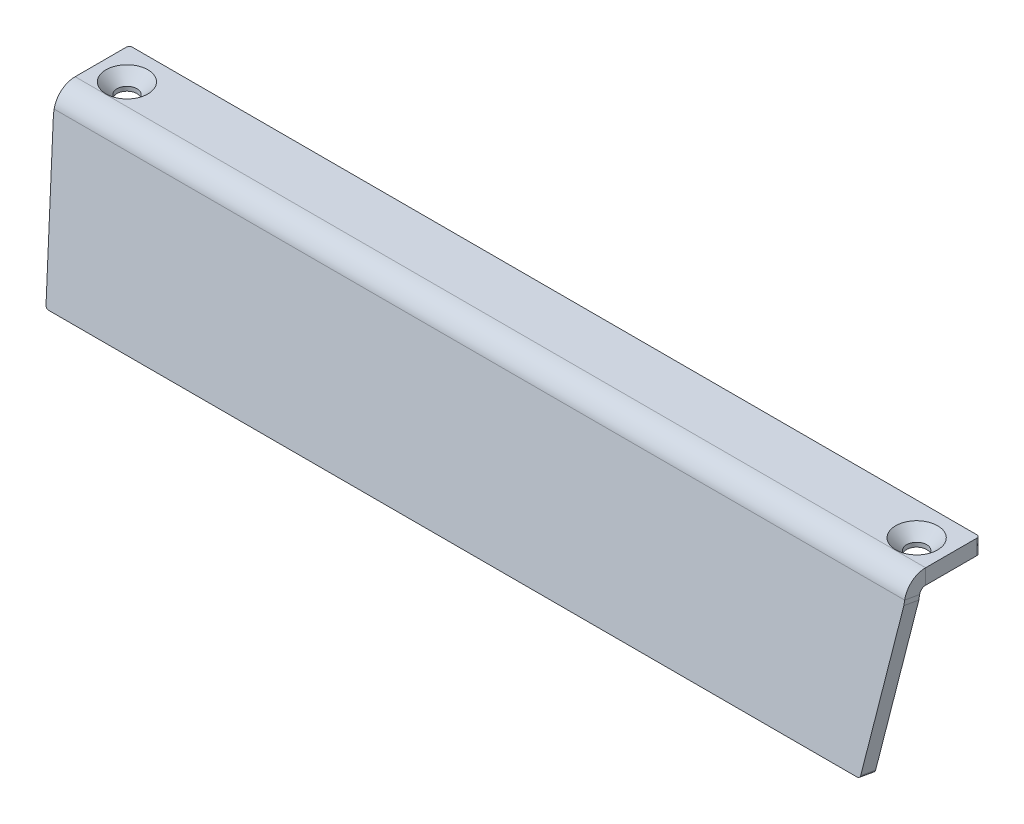
ISO-10303-21;
HEADER;
FILE_DESCRIPTION(('STEP AP214'),'2;1');
FILE_NAME('part.step','',(''),(''),'','','');
FILE_SCHEMA(('AUTOMOTIVE_DESIGN { 1 0 10303 214 1 1 1 1 }'));
ENDSEC;
DATA;
#1=APPLICATION_CONTEXT('core data for automotive mechanical design processes');
#2=APPLICATION_PROTOCOL_DEFINITION('international standard','automotive_design',2000,#1);
#3=PRODUCT_CONTEXT('',#1,'mechanical');
#4=PRODUCT('Part','Part','',(#3));
#5=PRODUCT_RELATED_PRODUCT_CATEGORY('part','',(#4));
#6=PRODUCT_DEFINITION_FORMATION('','',#4);
#7=PRODUCT_DEFINITION_CONTEXT('part definition',#1,'design');
#8=PRODUCT_DEFINITION('design','',#6,#7);
#9=PRODUCT_DEFINITION_SHAPE('','',#8);
#10=(LENGTH_UNIT() NAMED_UNIT(*) SI_UNIT(.MILLI.,.METRE.));
#11=(NAMED_UNIT(*) PLANE_ANGLE_UNIT() SI_UNIT($,.RADIAN.));
#12=(NAMED_UNIT(*) SI_UNIT($,.STERADIAN.) SOLID_ANGLE_UNIT());
#13=UNCERTAINTY_MEASURE_WITH_UNIT(LENGTH_MEASURE(1.E-05),#10,'distance_accuracy_value','');
#14=(GEOMETRIC_REPRESENTATION_CONTEXT(3) GLOBAL_UNCERTAINTY_ASSIGNED_CONTEXT((#13)) GLOBAL_UNIT_ASSIGNED_CONTEXT((#10,
#11,#12)) REPRESENTATION_CONTEXT('',''));
#15=CARTESIAN_POINT('',(0.,0.,0.));
#16=DIRECTION('',(0.,0.,1.));
#17=DIRECTION('',(1.,0.,0.));
#18=AXIS2_PLACEMENT_3D('',#15,#16,#17);
#19=CARTESIAN_POINT('',(-70.,-2.5,0.));
#20=DIRECTION('',(-1.,0.,0.));
#21=DIRECTION('',(0.,0.,1.));
#22=AXIS2_PLACEMENT_3D('',#19,#20,#21);
#23=PLANE('',#22);
#24=DIRECTION('',(0.,0.,1.));
#25=VECTOR('',#24,1.);
#26=CARTESIAN_POINT('',(-70.,0.,0.));
#27=LINE('',#26,#25);
#28=CARTESIAN_POINT('',(-70.,0.,0.5));
#29=VERTEX_POINT('',#28);
#30=CARTESIAN_POINT('',(-70.,0.,8.92000000000002));
#31=VERTEX_POINT('',#30);
#32=EDGE_CURVE('E225',#29,#31,#27,.T.);
#33=ORIENTED_EDGE('',*,*,#32,.F.);
#34=DIRECTION('',(0.,1.,0.));
#35=VECTOR('',#34,1.);
#36=CARTESIAN_POINT('',(-70.,-2.5,0.5));
#37=LINE('',#36,#35);
#38=CARTESIAN_POINT('',(-70.,-2.5,0.5));
#39=VERTEX_POINT('',#38);
#40=EDGE_CURVE('E87',#29,#39,#37,.F.);
#41=ORIENTED_EDGE('',*,*,#40,.T.);
#42=DIRECTION('',(0.,0.,1.));
#43=VECTOR('',#42,1.);
#44=CARTESIAN_POINT('',(-70.,-2.5,0.));
#45=LINE('',#44,#43);
#46=CARTESIAN_POINT('',(-70.,-2.50000000000001,8.92));
#47=VERTEX_POINT('',#46);
#48=EDGE_CURVE('E230',#39,#47,#45,.T.);
#49=ORIENTED_EDGE('',*,*,#48,.T.);
#50=DIRECTION('',(0.,1.,0.));
#51=VECTOR('',#50,1.);
#52=CARTESIAN_POINT('',(-70.,-2.5,8.92));
#53=LINE('',#52,#51);
#54=EDGE_CURVE('E240',#47,#31,#53,.T.);
#55=ORIENTED_EDGE('',*,*,#54,.T.);
#56=EDGE_LOOP('',(#33,#41,#49,#55));
#57=FACE_BOUND('',#56,.T.);
#58=ADVANCED_FACE('F64',(#57),#23,.T.);
#59=CARTESIAN_POINT('',(-70.,-2.5,0.));
#60=DIRECTION('',(0.,0.,-1.));
#61=DIRECTION('',(-1.,0.,0.));
#62=AXIS2_PLACEMENT_3D('',#59,#60,#61);
#63=PLANE('',#62);
#64=DIRECTION('',(-1.,0.,0.));
#65=VECTOR('',#64,1.);
#66=CARTESIAN_POINT('',(-70.,-2.5,0.));
#67=LINE('',#66,#65);
#68=CARTESIAN_POINT('',(69.5,-2.5,0.));
#69=VERTEX_POINT('',#68);
#70=CARTESIAN_POINT('',(-69.5,-2.5,0.));
#71=VERTEX_POINT('',#70);
#72=EDGE_CURVE('E237',#69,#71,#67,.T.);
#73=ORIENTED_EDGE('',*,*,#72,.T.);
#74=DIRECTION('',(0.,1.,0.));
#75=VECTOR('',#74,1.);
#76=CARTESIAN_POINT('',(-69.5,-2.5,0.));
#77=LINE('',#76,#75);
#78=CARTESIAN_POINT('',(-69.5,0.,0.));
#79=VERTEX_POINT('',#78);
#80=EDGE_CURVE('E285',#71,#79,#77,.T.);
#81=ORIENTED_EDGE('',*,*,#80,.T.);
#82=DIRECTION('',(-1.,0.,0.));
#83=VECTOR('',#82,1.);
#84=CARTESIAN_POINT('',(-70.,0.,0.));
#85=LINE('',#84,#83);
#86=CARTESIAN_POINT('',(69.5,0.,0.));
#87=VERTEX_POINT('',#86);
#88=EDGE_CURVE('E233',#87,#79,#85,.T.);
#89=ORIENTED_EDGE('',*,*,#88,.F.);
#90=DIRECTION('',(0.,1.,0.));
#91=VECTOR('',#90,1.);
#92=CARTESIAN_POINT('',(69.5,-2.5,0.));
#93=LINE('',#92,#91);
#94=EDGE_CURVE('E283',#87,#69,#93,.F.);
#95=ORIENTED_EDGE('',*,*,#94,.T.);
#96=EDGE_LOOP('',(#73,#81,#89,#95));
#97=FACE_BOUND('',#96,.T.);
#98=ADVANCED_FACE('F299',(#97),#63,.T.);
#99=CARTESIAN_POINT('',(70.,-2.5,0.));
#100=DIRECTION('',(1.,0.,0.));
#101=DIRECTION('',(0.,0.,-1.));
#102=AXIS2_PLACEMENT_3D('',#99,#100,#101);
#103=PLANE('',#102);
#104=DIRECTION('',(0.,0.,-1.));
#105=VECTOR('',#104,1.);
#106=CARTESIAN_POINT('',(70.,-2.5,0.));
#107=LINE('',#106,#105);
#108=CARTESIAN_POINT('',(70.,-2.50000000000001,8.92));
#109=VERTEX_POINT('',#108);
#110=CARTESIAN_POINT('',(70.,-2.5,0.499999999999983));
#111=VERTEX_POINT('',#110);
#112=EDGE_CURVE('E235',#109,#111,#107,.T.);
#113=ORIENTED_EDGE('',*,*,#112,.T.);
#114=DIRECTION('',(0.,1.,0.));
#115=VECTOR('',#114,1.);
#116=CARTESIAN_POINT('',(70.,-2.5,0.499999999999983));
#117=LINE('',#116,#115);
#118=CARTESIAN_POINT('',(70.,0.,0.499999999999983));
#119=VERTEX_POINT('',#118);
#120=EDGE_CURVE('E13',#111,#119,#117,.T.);
#121=ORIENTED_EDGE('',*,*,#120,.T.);
#122=DIRECTION('',(0.,0.,-1.));
#123=VECTOR('',#122,1.);
#124=CARTESIAN_POINT('',(70.,0.,0.));
#125=LINE('',#124,#123);
#126=CARTESIAN_POINT('',(70.,0.,8.91999999999998));
#127=VERTEX_POINT('',#126);
#128=EDGE_CURVE('E243',#127,#119,#125,.T.);
#129=ORIENTED_EDGE('',*,*,#128,.F.);
#130=DIRECTION('',(0.,1.,0.));
#131=VECTOR('',#130,1.);
#132=CARTESIAN_POINT('',(70.,-2.5,8.91999999999998));
#133=LINE('',#132,#131);
#134=EDGE_CURVE('E248',#109,#127,#133,.T.);
#135=ORIENTED_EDGE('',*,*,#134,.F.);
#136=EDGE_LOOP('',(#113,#121,#129,#135));
#137=FACE_BOUND('',#136,.T.);
#138=ADVANCED_FACE('F312',(#137),#103,.T.);
#139=CARTESIAN_POINT('',(0.,-2.5,0.));
#140=DIRECTION('',(0.,1.,0.));
#141=DIRECTION('',(0.,0.,1.));
#142=AXIS2_PLACEMENT_3D('',#139,#140,#141);
#143=PLANE('',#142);
#144=CARTESIAN_POINT('',(65.,-2.5,5.38999999999998));
#145=DIRECTION('',(0.,1.,0.));
#146=DIRECTION('',(0.,0.,1.));
#147=AXIS2_PLACEMENT_3D('',#144,#145,#146);
#148=CIRCLE('',#147,1.65);
#149=CARTESIAN_POINT('',(65.,-2.5,7.03999999999999));
#150=VERTEX_POINT('',#149);
#151=EDGE_CURVE('E367',#150,#150,#148,.T.);
#152=ORIENTED_EDGE('',*,*,#151,.T.);
#153=EDGE_LOOP('',(#152));
#154=FACE_BOUND('',#153,.T.);
#155=CARTESIAN_POINT('',(-65.,-2.5,5.39));
#156=DIRECTION('',(0.,1.,0.));
#157=DIRECTION('',(0.,0.,1.));
#158=AXIS2_PLACEMENT_3D('',#155,#156,#157);
#159=CIRCLE('',#158,1.65);
#160=CARTESIAN_POINT('',(-65.,-2.5,7.04));
#161=VERTEX_POINT('',#160);
#162=EDGE_CURVE('E224',#161,#161,#159,.T.);
#163=ORIENTED_EDGE('',*,*,#162,.T.);
#164=EDGE_LOOP('',(#163));
#165=FACE_BOUND('',#164,.T.);
#166=ORIENTED_EDGE('',*,*,#48,.F.);
#167=CARTESIAN_POINT('',(-69.5,-2.5,0.5));
#168=DIRECTION('',(0.,1.,0.));
#169=DIRECTION('',(0.,0.,1.));
#170=AXIS2_PLACEMENT_3D('',#167,#168,#169);
#171=CIRCLE('',#170,0.5);
#172=EDGE_CURVE('E72',#39,#71,#171,.F.);
#173=ORIENTED_EDGE('',*,*,#172,.T.);
#174=ORIENTED_EDGE('',*,*,#72,.F.);
#175=CARTESIAN_POINT('',(69.5,-2.5,0.499999999999983));
#176=DIRECTION('',(0.,1.,0.));
#177=DIRECTION('',(0.,0.,1.));
#178=AXIS2_PLACEMENT_3D('',#175,#176,#177);
#179=CIRCLE('',#178,0.5);
#180=EDGE_CURVE('E79',#69,#111,#179,.F.);
#181=ORIENTED_EDGE('',*,*,#180,.T.);
#182=ORIENTED_EDGE('',*,*,#112,.F.);
#183=DIRECTION('',(1.,0.,0.));
#184=VECTOR('',#183,1.);
#185=CARTESIAN_POINT('',(-70.,-2.5,8.92));
#186=LINE('',#185,#184);
#187=EDGE_CURVE('E232',#47,#109,#186,.T.);
#188=ORIENTED_EDGE('',*,*,#187,.F.);
#189=EDGE_LOOP('',(#166,#173,#174,#181,#182,#188));
#190=FACE_BOUND('',#189,.T.);
#191=ADVANCED_FACE('F294',(#154,#165,#190),#143,.F.);
#192=CARTESIAN_POINT('',(0.,0.,0.));
#193=DIRECTION('',(0.,1.,0.));
#194=DIRECTION('',(0.,0.,1.));
#195=AXIS2_PLACEMENT_3D('',#192,#193,#194);
#196=PLANE('',#195);
#197=CARTESIAN_POINT('',(-65.,0.,5.38999999999998));
#198=DIRECTION('',(0.,1.,0.));
#199=DIRECTION('',(0.,0.,-1.));
#200=AXIS2_PLACEMENT_3D('',#197,#198,#199);
#201=CIRCLE('',#200,3.45000000000001);
#202=CARTESIAN_POINT('',(-65.,0.,1.93999999999998));
#203=VERTEX_POINT('',#202);
#204=EDGE_CURVE('E379',#203,#203,#201,.T.);
#205=ORIENTED_EDGE('',*,*,#204,.F.);
#206=EDGE_LOOP('',(#205));
#207=FACE_BOUND('',#206,.T.);
#208=CARTESIAN_POINT('',(65.,0.,5.38999999999998));
#209=DIRECTION('',(0.,-1.,0.));
#210=DIRECTION('',(0.,0.,-1.));
#211=AXIS2_PLACEMENT_3D('',#208,#209,#210);
#212=CIRCLE('',#211,3.45000000000001);
#213=CARTESIAN_POINT('',(65.,0.,1.93999999999998));
#214=VERTEX_POINT('',#213);
#215=EDGE_CURVE('E373',#214,#214,#212,.T.);
#216=ORIENTED_EDGE('',*,*,#215,.T.);
#217=EDGE_LOOP('',(#216));
#218=FACE_BOUND('',#217,.T.);
#219=ORIENTED_EDGE('',*,*,#88,.T.);
#220=CARTESIAN_POINT('',(-69.5,0.,0.5));
#221=DIRECTION('',(0.,1.,0.));
#222=DIRECTION('',(0.,0.,1.));
#223=AXIS2_PLACEMENT_3D('',#220,#221,#222);
#224=CIRCLE('',#223,0.5);
#225=EDGE_CURVE('E290',#79,#29,#224,.T.);
#226=ORIENTED_EDGE('',*,*,#225,.T.);
#227=ORIENTED_EDGE('',*,*,#32,.T.);
#228=DIRECTION('',(1.,0.,0.));
#229=VECTOR('',#228,1.);
#230=CARTESIAN_POINT('',(-70.,0.,8.92));
#231=LINE('',#230,#229);
#232=EDGE_CURVE('E176',#31,#127,#231,.T.);
#233=ORIENTED_EDGE('',*,*,#232,.T.);
#234=ORIENTED_EDGE('',*,*,#128,.T.);
#235=CARTESIAN_POINT('',(69.5,0.,0.499999999999983));
#236=DIRECTION('',(0.,1.,0.));
#237=DIRECTION('',(0.,0.,1.));
#238=AXIS2_PLACEMENT_3D('',#235,#236,#237);
#239=CIRCLE('',#238,0.5);
#240=EDGE_CURVE('E288',#119,#87,#239,.T.);
#241=ORIENTED_EDGE('',*,*,#240,.T.);
#242=EDGE_LOOP('',(#219,#226,#227,#233,#234,#241));
#243=FACE_BOUND('',#242,.T.);
#244=ADVANCED_FACE('F304',(#207,#218,#243),#196,.T.);
#245=CARTESIAN_POINT('',(70.,-3.5,8.91999999999999));
#246=DIRECTION('',(1.,0.,0.));
#247=DIRECTION('',(0.,0.,-1.));
#248=AXIS2_PLACEMENT_3D('',#245,#246,#247);
#249=PLANE('',#248);
#250=DIRECTION('',(0.,-0.173648177666934,-0.984807753012207));
#251=VECTOR('',#250,1.);
#252=CARTESIAN_POINT('',(70.,-2.89223137816573,12.3668271355427));
#253=LINE('',#252,#251);
#254=CARTESIAN_POINT('',(70.,-3.32635182233307,9.90480775301219));
#255=VERTEX_POINT('',#254);
#256=CARTESIAN_POINT('',(70.,-2.89223137816573,12.3668271355427));
#257=VERTEX_POINT('',#256);
#258=EDGE_CURVE('E221',#255,#257,#253,.F.);
#259=ORIENTED_EDGE('',*,*,#258,.F.);
#260=CARTESIAN_POINT('',(70.,-3.5,8.91999999999999));
#261=DIRECTION('',(-1.,0.,0.));
#262=DIRECTION('',(0.,0.,1.));
#263=AXIS2_PLACEMENT_3D('',#260,#261,#262);
#264=CIRCLE('',#263,0.999999999999993);
#265=EDGE_CURVE('E181',#109,#255,#264,.F.);
#266=ORIENTED_EDGE('',*,*,#265,.F.);
#267=ORIENTED_EDGE('',*,*,#134,.T.);
#268=CARTESIAN_POINT('',(70.,-3.5,8.91999999999999));
#269=DIRECTION('',(-1.,0.,0.));
#270=DIRECTION('',(0.,0.,1.));
#271=AXIS2_PLACEMENT_3D('',#268,#269,#270);
#272=CIRCLE('',#271,3.49999999999999);
#273=EDGE_CURVE('E180',#127,#257,#272,.F.);
#274=ORIENTED_EDGE('',*,*,#273,.T.);
#275=EDGE_LOOP('',(#259,#266,#267,#274));
#276=FACE_BOUND('',#275,.T.);
#277=ADVANCED_FACE('F387',(#276),#249,.T.);
#278=CARTESIAN_POINT('',(-70.,-3.5,8.91999999999999));
#279=DIRECTION('',(1.,0.,0.));
#280=DIRECTION('',(0.,0.,-1.));
#281=AXIS2_PLACEMENT_3D('',#278,#279,#280);
#282=PLANE('',#281);
#283=CARTESIAN_POINT('',(-70.,-3.5,8.91999999999999));
#284=DIRECTION('',(-1.,0.,0.));
#285=DIRECTION('',(0.,0.,1.));
#286=AXIS2_PLACEMENT_3D('',#283,#284,#285);
#287=CIRCLE('',#286,0.999999999999993);
#288=CARTESIAN_POINT('',(-70.,-3.32635182233307,9.90480775301219));
#289=VERTEX_POINT('',#288);
#290=EDGE_CURVE('E188',#289,#47,#287,.T.);
#291=ORIENTED_EDGE('',*,*,#290,.F.);
#292=DIRECTION('',(0.,-0.173648177666934,-0.984807753012207));
#293=VECTOR('',#292,1.);
#294=CARTESIAN_POINT('',(-70.,-3.32635182233307,9.90480775301221));
#295=LINE('',#294,#293);
#296=CARTESIAN_POINT('',(-70.,-2.89223137816573,12.3668271355427));
#297=VERTEX_POINT('',#296);
#298=EDGE_CURVE('E185',#289,#297,#295,.F.);
#299=ORIENTED_EDGE('',*,*,#298,.T.);
#300=CARTESIAN_POINT('',(-70.,-3.5,8.91999999999999));
#301=DIRECTION('',(-1.,0.,0.));
#302=DIRECTION('',(0.,0.,1.));
#303=AXIS2_PLACEMENT_3D('',#300,#301,#302);
#304=CIRCLE('',#303,3.49999999999999);
#305=EDGE_CURVE('E169',#297,#31,#304,.T.);
#306=ORIENTED_EDGE('',*,*,#305,.T.);
#307=ORIENTED_EDGE('',*,*,#54,.F.);
#308=EDGE_LOOP('',(#291,#299,#306,#307));
#309=FACE_BOUND('',#308,.T.);
#310=ADVANCED_FACE('F186',(#309),#282,.F.);
#311=CARTESIAN_POINT('',(-70.,-3.5,8.91999999999999));
#312=DIRECTION('',(-1.,0.,0.));
#313=DIRECTION('',(0.,0.173648177666934,0.984807753012207));
#314=AXIS2_PLACEMENT_3D('',#311,#312,#313);
#315=CYLINDRICAL_SURFACE('',#314,3.49999999999999);
#316=ORIENTED_EDGE('',*,*,#232,.F.);
#317=ORIENTED_EDGE('',*,*,#305,.F.);
#318=DIRECTION('',(-1.,0.,0.));
#319=VECTOR('',#318,1.);
#320=CARTESIAN_POINT('',(70.,-2.89223137816573,12.3668271355427));
#321=LINE('',#320,#319);
#322=EDGE_CURVE('E173',#297,#257,#321,.F.);
#323=ORIENTED_EDGE('',*,*,#322,.T.);
#324=ORIENTED_EDGE('',*,*,#273,.F.);
#325=EDGE_LOOP('',(#316,#317,#323,#324));
#326=FACE_BOUND('',#325,.T.);
#327=ADVANCED_FACE('F171',(#326),#315,.T.);
#328=CARTESIAN_POINT('',(-70.,-3.5,8.91999999999999));
#329=DIRECTION('',(-1.,0.,0.));
#330=DIRECTION('',(0.,0.173648177666934,0.984807753012207));
#331=AXIS2_PLACEMENT_3D('',#328,#329,#330);
#332=CYLINDRICAL_SURFACE('',#331,0.999999999999993);
#333=ORIENTED_EDGE('',*,*,#187,.T.);
#334=ORIENTED_EDGE('',*,*,#265,.T.);
#335=DIRECTION('',(-1.,0.,0.));
#336=VECTOR('',#335,1.);
#337=CARTESIAN_POINT('',(70.,-3.32635182233306,9.90480775301219));
#338=LINE('',#337,#336);
#339=EDGE_CURVE('E193',#255,#289,#338,.T.);
#340=ORIENTED_EDGE('',*,*,#339,.T.);
#341=ORIENTED_EDGE('',*,*,#290,.T.);
#342=EDGE_LOOP('',(#333,#334,#340,#341));
#343=FACE_BOUND('',#342,.T.);
#344=ADVANCED_FACE('F306',(#343),#332,.F.);
#345=CARTESIAN_POINT('',(-70.,-27.6708811341501,16.7359716330481));
#346=DIRECTION('',(1.,0.,0.));
#347=DIRECTION('',(0.,0.,-1.));
#348=AXIS2_PLACEMENT_3D('',#345,#346,#347);
#349=PLANE('',#348);
#350=DIRECTION('',(0.,0.984807753012207,-0.173648177666934));
#351=VECTOR('',#350,1.);
#352=CARTESIAN_POINT('',(-70.,-28.1050015783174,14.2739522505176));
#353=LINE('',#352,#351);
#354=CARTESIAN_POINT('',(-70.,-4.04315506185744,10.0311995039996));
#355=VERTEX_POINT('',#354);
#356=EDGE_CURVE('E203',#289,#355,#353,.F.);
#357=ORIENTED_EDGE('',*,*,#356,.T.);
#358=DIRECTION('',(0.,0.173648177666934,0.984807753012207));
#359=VECTOR('',#358,1.);
#360=CARTESIAN_POINT('',(-70.,-3.60903461769011,12.4932188865301));
#361=LINE('',#360,#359);
#362=CARTESIAN_POINT('',(-70.,-3.60903461769007,12.4932188865301));
#363=VERTEX_POINT('',#362);
#364=EDGE_CURVE('E207',#355,#363,#361,.T.);
#365=ORIENTED_EDGE('',*,*,#364,.T.);
#366=DIRECTION('',(0.,-0.984807753012207,0.173648177666934));
#367=VECTOR('',#366,1.);
#368=CARTESIAN_POINT('',(-70.,1.88414605938223,11.5246229232558));
#369=LINE('',#368,#367);
#370=EDGE_CURVE('E199',#297,#363,#369,.T.);
#371=ORIENTED_EDGE('',*,*,#370,.F.);
#372=ORIENTED_EDGE('',*,*,#298,.F.);
#373=EDGE_LOOP('',(#357,#365,#371,#372));
#374=FACE_BOUND('',#373,.T.);
#375=ADVANCED_FACE('F205',(#374),#349,.F.);
#376=CARTESIAN_POINT('',(70.,-2.06587955583266,12.2211190137078));
#377=DIRECTION('',(-1.,0.,0.));
#378=DIRECTION('',(0.,0.,1.));
#379=AXIS2_PLACEMENT_3D('',#376,#377,#378);
#380=PLANE('',#379);
#381=DIRECTION('',(0.,0.984807753012207,-0.173648177666934));
#382=VECTOR('',#381,1.);
#383=CARTESIAN_POINT('',(70.,1.88414605938223,11.5246229232558));
#384=LINE('',#383,#382);
#385=CARTESIAN_POINT('',(70.,-3.60903461769001,12.4932188865301));
#386=VERTEX_POINT('',#385);
#387=EDGE_CURVE('E202',#386,#257,#384,.T.);
#388=ORIENTED_EDGE('',*,*,#387,.F.);
#389=DIRECTION('',(0.,-0.173648177666934,-0.984807753012207));
#390=VECTOR('',#389,1.);
#391=CARTESIAN_POINT('',(70.,-3.60903461769011,12.4932188865301));
#392=LINE('',#391,#390);
#393=CARTESIAN_POINT('',(70.,-4.04315506185725,10.0311995039995));
#394=VERTEX_POINT('',#393);
#395=EDGE_CURVE('E262',#386,#394,#392,.T.);
#396=ORIENTED_EDGE('',*,*,#395,.T.);
#397=DIRECTION('',(0.,-0.984807753012207,0.173648177666934));
#398=VECTOR('',#397,1.);
#399=CARTESIAN_POINT('',(70.,-2.5,9.75909963117726));
#400=LINE('',#399,#398);
#401=EDGE_CURVE('E209',#394,#255,#400,.F.);
#402=ORIENTED_EDGE('',*,*,#401,.T.);
#403=ORIENTED_EDGE('',*,*,#258,.T.);
#404=EDGE_LOOP('',(#388,#396,#402,#403));
#405=FACE_BOUND('',#404,.T.);
#406=ADVANCED_FACE('F362',(#405),#380,.F.);
#407=CARTESIAN_POINT('',(0.,1.88414605938223,11.5246229232558));
#408=DIRECTION('',(0.,-0.173648177666934,-0.984807753012207));
#409=DIRECTION('',(0.,0.984807753012207,-0.173648177666934));
#410=AXIS2_PLACEMENT_3D('',#407,#408,#409);
#411=PLANE('',#410);
#412=DIRECTION('',(-0.121869343405148,0.977467145358804,-0.172353830482844));
#413=VECTOR('',#412,1.);
#414=CARTESIAN_POINT('',(-67.,-27.6708811341501,16.7359716330481));
#415=LINE('',#414,#413);
#416=CARTESIAN_POINT('',(-67.0539104435427,-27.2384861947639,16.6597287389125));
#417=VERTEX_POINT('',#416);
#418=EDGE_CURVE('E260',#363,#417,#415,.F.);
#419=ORIENTED_EDGE('',*,*,#418,.T.);
#420=CARTESIAN_POINT('',(-66.557637367722,-27.1784772576439,16.6491475442146));
#421=DIRECTION('',(0.,-0.173648177666934,-0.984807753012207));
#422=DIRECTION('',(0.,0.984807753012207,-0.173648177666934));
#423=AXIS2_PLACEMENT_3D('',#420,#421,#422);
#424=CIRCLE('',#423,0.5);
#425=CARTESIAN_POINT('',(-66.557637367722,-27.6708811341501,16.7359716330481));
#426=VERTEX_POINT('',#425);
#427=EDGE_CURVE('E279',#417,#426,#424,.F.);
#428=ORIENTED_EDGE('',*,*,#427,.T.);
#429=DIRECTION('',(1.,0.,0.));
#430=VECTOR('',#429,1.);
#431=CARTESIAN_POINT('',(0.,-27.6708811341501,16.7359716330481));
#432=LINE('',#431,#430);
#433=CARTESIAN_POINT('',(66.557637367722,-27.6708811341501,16.7359716330481));
#434=VERTEX_POINT('',#433);
#435=EDGE_CURVE('E208',#426,#434,#432,.T.);
#436=ORIENTED_EDGE('',*,*,#435,.T.);
#437=CARTESIAN_POINT('',(66.557637367722,-27.1784772576439,16.6491475442146));
#438=DIRECTION('',(0.,-0.173648177666934,-0.984807753012207));
#439=DIRECTION('',(0.,0.984807753012207,-0.173648177666934));
#440=AXIS2_PLACEMENT_3D('',#437,#438,#439);
#441=CIRCLE('',#440,0.5);
#442=CARTESIAN_POINT('',(67.0539104435427,-27.2384861947639,16.6597287389125));
#443=VERTEX_POINT('',#442);
#444=EDGE_CURVE('E277',#434,#443,#441,.F.);
#445=ORIENTED_EDGE('',*,*,#444,.T.);
#446=DIRECTION('',(-0.121869343405148,-0.977467145358804,0.172353830482844));
#447=VECTOR('',#446,1.);
#448=CARTESIAN_POINT('',(70.,-3.60903461769011,12.4932188865301));
#449=LINE('',#448,#447);
#450=EDGE_CURVE('E258',#443,#386,#449,.F.);
#451=ORIENTED_EDGE('',*,*,#450,.T.);
#452=ORIENTED_EDGE('',*,*,#387,.T.);
#453=ORIENTED_EDGE('',*,*,#322,.F.);
#454=ORIENTED_EDGE('',*,*,#370,.T.);
#455=EDGE_LOOP('',(#419,#428,#436,#445,#451,#452,#453,#454));
#456=FACE_BOUND('',#455,.T.);
#457=ADVANCED_FACE('F198',(#456),#411,.F.);
#458=CARTESIAN_POINT('',(0.,1.4500256152149,9.06260354072531));
#459=DIRECTION('',(0.,-0.173648177666934,-0.984807753012207));
#460=DIRECTION('',(0.,0.984807753012207,-0.173648177666934));
#461=AXIS2_PLACEMENT_3D('',#458,#459,#460);
#462=PLANE('',#461);
#463=DIRECTION('',(-1.,0.,0.));
#464=VECTOR('',#463,1.);
#465=CARTESIAN_POINT('',(70.,-28.1050015783174,14.2739522505175));
#466=LINE('',#465,#464);
#467=CARTESIAN_POINT('',(-66.557637367722,-28.1050015783174,14.2739522505176));
#468=VERTEX_POINT('',#467);
#469=CARTESIAN_POINT('',(66.557637367722,-28.1050015783174,14.2739522505175));
#470=VERTEX_POINT('',#469);
#471=EDGE_CURVE('E213',#468,#470,#466,.F.);
#472=ORIENTED_EDGE('',*,*,#471,.F.);
#473=CARTESIAN_POINT('',(-66.557637367722,-27.6125977018113,14.1871281616841));
#474=DIRECTION('',(0.,-0.173648177666934,-0.984807753012207));
#475=DIRECTION('',(0.,0.984807753012207,-0.173648177666934));
#476=AXIS2_PLACEMENT_3D('',#473,#474,#475);
#477=CIRCLE('',#476,0.5);
#478=CARTESIAN_POINT('',(-67.0539104435427,-27.6726066389312,14.197709356382));
#479=VERTEX_POINT('',#478);
#480=EDGE_CURVE('E273',#468,#479,#477,.T.);
#481=ORIENTED_EDGE('',*,*,#480,.T.);
#482=DIRECTION('',(0.121869343405148,-0.977467145358804,0.172353830482844));
#483=VECTOR('',#482,1.);
#484=CARTESIAN_POINT('',(-69.6350611325904,-6.97018940035739,10.5473146313373));
#485=LINE('',#484,#483);
#486=EDGE_CURVE('E255',#479,#355,#485,.F.);
#487=ORIENTED_EDGE('',*,*,#486,.T.);
#488=ORIENTED_EDGE('',*,*,#356,.F.);
#489=ORIENTED_EDGE('',*,*,#339,.F.);
#490=ORIENTED_EDGE('',*,*,#401,.F.);
#491=DIRECTION('',(0.121869343405148,0.977467145358804,-0.172353830482844));
#492=VECTOR('',#491,1.);
#493=CARTESIAN_POINT('',(69.6350611325904,-6.9701894003574,10.5473146313373));
#494=LINE('',#493,#492);
#495=CARTESIAN_POINT('',(67.0539104435427,-27.6726066389312,14.197709356382));
#496=VERTEX_POINT('',#495);
#497=EDGE_CURVE('E251',#394,#496,#494,.F.);
#498=ORIENTED_EDGE('',*,*,#497,.T.);
#499=CARTESIAN_POINT('',(66.557637367722,-27.6125977018113,14.1871281616841));
#500=DIRECTION('',(0.,-0.173648177666934,-0.984807753012207));
#501=DIRECTION('',(0.,0.984807753012207,-0.173648177666934));
#502=AXIS2_PLACEMENT_3D('',#499,#500,#501);
#503=CIRCLE('',#502,0.5);
#504=EDGE_CURVE('E271',#496,#470,#503,.T.);
#505=ORIENTED_EDGE('',*,*,#504,.T.);
#506=EDGE_LOOP('',(#472,#481,#487,#488,#489,#490,#498,#505));
#507=FACE_BOUND('',#506,.T.);
#508=ADVANCED_FACE('F350',(#507),#462,.T.);
#509=CARTESIAN_POINT('',(70.,-27.6708811341501,16.7359716330481));
#510=DIRECTION('',(0.,0.984807753012207,-0.173648177666934));
#511=DIRECTION('',(0.,0.173648177666934,0.984807753012207));
#512=AXIS2_PLACEMENT_3D('',#509,#510,#511);
#513=PLANE('',#512);
#514=ORIENTED_EDGE('',*,*,#435,.F.);
#515=DIRECTION('',(0.,0.173648177666934,0.984807753012207));
#516=VECTOR('',#515,1.);
#517=CARTESIAN_POINT('',(-66.557637367722,-28.1050015783174,14.2739522505176));
#518=LINE('',#517,#516);
#519=EDGE_CURVE('E268',#426,#468,#518,.F.);
#520=ORIENTED_EDGE('',*,*,#519,.T.);
#521=ORIENTED_EDGE('',*,*,#471,.T.);
#522=DIRECTION('',(0.,-0.173648177666934,-0.984807753012207));
#523=VECTOR('',#522,1.);
#524=CARTESIAN_POINT('',(66.557637367722,-27.6708811341501,16.7359716330481));
#525=LINE('',#524,#523);
#526=EDGE_CURVE('E265',#470,#434,#525,.F.);
#527=ORIENTED_EDGE('',*,*,#526,.T.);
#528=EDGE_LOOP('',(#514,#520,#521,#527));
#529=FACE_BOUND('',#528,.T.);
#530=ADVANCED_FACE('F354',(#529),#513,.F.);
#531=CARTESIAN_POINT('',(-65.,-28.1050015783174,5.39));
#532=DIRECTION('',(0.,1.,0.));
#533=DIRECTION('',(0.,0.,1.));
#534=AXIS2_PLACEMENT_3D('',#531,#532,#533);
#535=CYLINDRICAL_SURFACE('',#534,1.65);
#536=CARTESIAN_POINT('',(-65.,-1.8,5.38999999999998));
#537=DIRECTION('',(0.,1.,0.));
#538=DIRECTION('',(0.,0.,-1.));
#539=AXIS2_PLACEMENT_3D('',#536,#537,#538);
#540=CIRCLE('',#539,1.65);
#541=CARTESIAN_POINT('',(-65.,-1.8,3.73999999999998));
#542=VERTEX_POINT('',#541);
#543=EDGE_CURVE('E376',#542,#542,#540,.T.);
#544=ORIENTED_EDGE('',*,*,#543,.T.);
#545=EDGE_LOOP('',(#544));
#546=FACE_BOUND('',#545,.T.);
#547=ORIENTED_EDGE('',*,*,#162,.F.);
#548=EDGE_LOOP('',(#547));
#549=FACE_BOUND('',#548,.T.);
#550=ADVANCED_FACE('F400',(#546,#549),#535,.F.);
#551=CARTESIAN_POINT('',(65.,-28.1050015783174,5.38999999999998));
#552=DIRECTION('',(0.,1.,0.));
#553=DIRECTION('',(0.,0.,1.));
#554=AXIS2_PLACEMENT_3D('',#551,#552,#553);
#555=CYLINDRICAL_SURFACE('',#554,1.65);
#556=CARTESIAN_POINT('',(65.,-1.8,5.38999999999998));
#557=DIRECTION('',(0.,-1.,0.));
#558=DIRECTION('',(0.,0.,-1.));
#559=AXIS2_PLACEMENT_3D('',#556,#557,#558);
#560=CIRCLE('',#559,1.65);
#561=CARTESIAN_POINT('',(65.,-1.8,3.73999999999998));
#562=VERTEX_POINT('',#561);
#563=EDGE_CURVE('E370',#562,#562,#560,.T.);
#564=ORIENTED_EDGE('',*,*,#563,.F.);
#565=EDGE_LOOP('',(#564));
#566=FACE_BOUND('',#565,.T.);
#567=ORIENTED_EDGE('',*,*,#151,.F.);
#568=EDGE_LOOP('',(#567));
#569=FACE_BOUND('',#568,.T.);
#570=ADVANCED_FACE('F394',(#566,#569),#555,.F.);
#571=CARTESIAN_POINT('',(65.,-1.8,5.38999999999998));
#572=DIRECTION('',(0.,1.,0.));
#573=DIRECTION('',(0.,0.,1.));
#574=AXIS2_PLACEMENT_3D('',#571,#572,#573);
#575=CONICAL_SURFACE('',#574,1.65,0.78539816339745);
#576=ORIENTED_EDGE('',*,*,#215,.F.);
#577=EDGE_LOOP('',(#576));
#578=FACE_BOUND('',#577,.T.);
#579=ORIENTED_EDGE('',*,*,#563,.T.);
#580=EDGE_LOOP('',(#579));
#581=FACE_BOUND('',#580,.T.);
#582=ADVANCED_FACE('F391',(#578,#581),#575,.F.);
#583=CARTESIAN_POINT('',(-65.,-1.8,5.38999999999998));
#584=DIRECTION('',(0.,1.,0.));
#585=DIRECTION('',(0.,0.,1.));
#586=AXIS2_PLACEMENT_3D('',#583,#584,#585);
#587=CONICAL_SURFACE('',#586,1.65,0.78539816339745);
#588=ORIENTED_EDGE('',*,*,#204,.T.);
#589=EDGE_LOOP('',(#588));
#590=FACE_BOUND('',#589,.T.);
#591=ORIENTED_EDGE('',*,*,#543,.F.);
#592=EDGE_LOOP('',(#591));
#593=FACE_BOUND('',#592,.T.);
#594=ADVANCED_FACE('F332',(#590,#593),#587,.F.);
#595=CARTESIAN_POINT('',(-67.,-27.6708811341501,16.7359716330481));
#596=DIRECTION('',(0.992546151641322,0.120017874239897,-0.0211623893957698));
#597=DIRECTION('',(0.,-0.173648177666934,-0.984807753012207));
#598=AXIS2_PLACEMENT_3D('',#595,#596,#597);
#599=PLANE('',#598);
#600=ORIENTED_EDGE('',*,*,#486,.F.);
#601=DIRECTION('',(0.,-0.173648177666934,-0.984807753012207));
#602=VECTOR('',#601,1.);
#603=CARTESIAN_POINT('',(-67.0539104435427,-27.2384861947639,16.6597287389125));
#604=LINE('',#603,#602);
#605=EDGE_CURVE('E275',#479,#417,#604,.F.);
#606=ORIENTED_EDGE('',*,*,#605,.T.);
#607=ORIENTED_EDGE('',*,*,#418,.F.);
#608=ORIENTED_EDGE('',*,*,#364,.F.);
#609=EDGE_LOOP('',(#600,#606,#607,#608));
#610=FACE_BOUND('',#609,.T.);
#611=ADVANCED_FACE('F328',(#610),#599,.F.);
#612=CARTESIAN_POINT('',(70.,-3.60903461769011,12.4932188865301));
#613=DIRECTION('',(-0.992546151641322,0.120017874239897,-0.0211623893957696));
#614=DIRECTION('',(0.,-0.173648177666934,-0.984807753012207));
#615=AXIS2_PLACEMENT_3D('',#612,#613,#614);
#616=PLANE('',#615);
#617=ORIENTED_EDGE('',*,*,#450,.F.);
#618=DIRECTION('',(0.,0.173648177666934,0.984807753012207));
#619=VECTOR('',#618,1.);
#620=CARTESIAN_POINT('',(67.0539104435427,-27.6726066389312,14.197709356382));
#621=LINE('',#620,#619);
#622=EDGE_CURVE('E281',#443,#496,#621,.F.);
#623=ORIENTED_EDGE('',*,*,#622,.T.);
#624=ORIENTED_EDGE('',*,*,#497,.F.);
#625=ORIENTED_EDGE('',*,*,#395,.F.);
#626=EDGE_LOOP('',(#617,#623,#624,#625));
#627=FACE_BOUND('',#626,.T.);
#628=ADVANCED_FACE('F331',(#627),#616,.F.);
#629=CARTESIAN_POINT('',(-66.557637367722,-27.1784772576439,16.6491475442146));
#630=DIRECTION('',(0.,-0.173648177666934,-0.984807753012207));
#631=DIRECTION('',(0.,0.984807753012208,-0.173648177666934));
#632=AXIS2_PLACEMENT_3D('',#629,#630,#631);
#633=CYLINDRICAL_SURFACE('',#632,0.5);
#634=ORIENTED_EDGE('',*,*,#427,.F.);
#635=ORIENTED_EDGE('',*,*,#605,.F.);
#636=ORIENTED_EDGE('',*,*,#480,.F.);
#637=ORIENTED_EDGE('',*,*,#519,.F.);
#638=EDGE_LOOP('',(#634,#635,#636,#637));
#639=FACE_BOUND('',#638,.T.);
#640=ADVANCED_FACE('F336',(#639),#633,.T.);
#641=CARTESIAN_POINT('',(66.557637367722,-27.1784772576439,16.6491475442146));
#642=DIRECTION('',(0.,0.173648177666934,0.984807753012207));
#643=DIRECTION('',(0.,-0.984807753012207,0.173648177666934));
#644=AXIS2_PLACEMENT_3D('',#641,#642,#643);
#645=CYLINDRICAL_SURFACE('',#644,0.5);
#646=ORIENTED_EDGE('',*,*,#504,.F.);
#647=ORIENTED_EDGE('',*,*,#622,.F.);
#648=ORIENTED_EDGE('',*,*,#444,.F.);
#649=ORIENTED_EDGE('',*,*,#526,.F.);
#650=EDGE_LOOP('',(#646,#647,#648,#649));
#651=FACE_BOUND('',#650,.T.);
#652=ADVANCED_FACE('F319',(#651),#645,.T.);
#653=CARTESIAN_POINT('',(-69.5,-2.5,0.5));
#654=DIRECTION('',(0.,1.,0.));
#655=DIRECTION('',(0.,0.,1.));
#656=AXIS2_PLACEMENT_3D('',#653,#654,#655);
#657=CYLINDRICAL_SURFACE('',#656,0.5);
#658=ORIENTED_EDGE('',*,*,#172,.F.);
#659=ORIENTED_EDGE('',*,*,#40,.F.);
#660=ORIENTED_EDGE('',*,*,#225,.F.);
#661=ORIENTED_EDGE('',*,*,#80,.F.);
#662=EDGE_LOOP('',(#658,#659,#660,#661));
#663=FACE_BOUND('',#662,.T.);
#664=ADVANCED_FACE('F302',(#663),#657,.T.);
#665=CARTESIAN_POINT('',(69.5,-2.5,0.499999999999983));
#666=DIRECTION('',(0.,1.,0.));
#667=DIRECTION('',(0.,0.,1.));
#668=AXIS2_PLACEMENT_3D('',#665,#666,#667);
#669=CYLINDRICAL_SURFACE('',#668,0.5);
#670=ORIENTED_EDGE('',*,*,#180,.F.);
#671=ORIENTED_EDGE('',*,*,#94,.F.);
#672=ORIENTED_EDGE('',*,*,#240,.F.);
#673=ORIENTED_EDGE('',*,*,#120,.F.);
#674=EDGE_LOOP('',(#670,#671,#672,#673));
#675=FACE_BOUND('',#674,.T.);
#676=ADVANCED_FACE('F66',(#675),#669,.T.);
#677=CLOSED_SHELL('',(#58,#98,#138,#191,#244,#277,#310,#327,#344,#375,#406,#457,#508,#530,#550,
#570,#582,#594,#611,#628,#640,#652,#664,#676));
#678=MANIFOLD_SOLID_BREP('B2',#677);
#679=ADVANCED_BREP_SHAPE_REPRESENTATION('',(#18,#678),#14);
#680=SHAPE_DEFINITION_REPRESENTATION(#9,#679);
ENDSEC;
END-ISO-10303-21;
